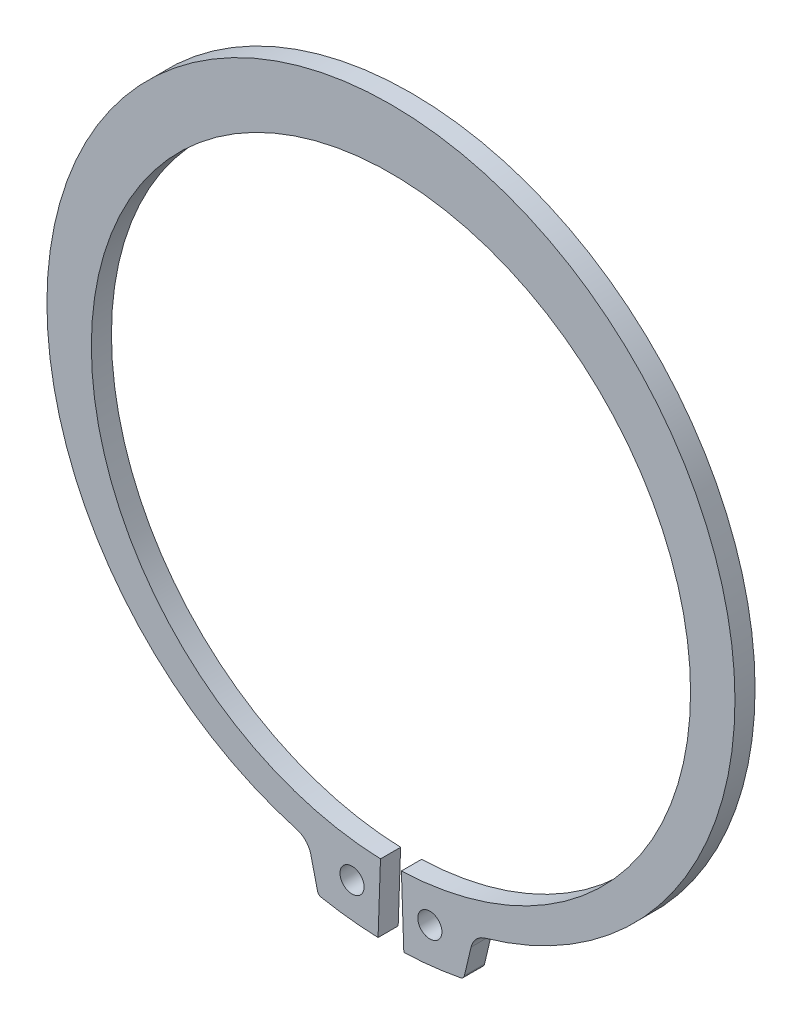
ISO-10303-21;
HEADER;
FILE_DESCRIPTION(('STEP AP214'),'2;1');
FILE_NAME('part.step','',(''),(''),'','','');
FILE_SCHEMA(('AUTOMOTIVE_DESIGN { 1 0 10303 214 1 1 1 1 }'));
ENDSEC;
DATA;
#1=APPLICATION_CONTEXT('core data for automotive mechanical design processes');
#2=APPLICATION_PROTOCOL_DEFINITION('international standard','automotive_design',2000,#1);
#3=PRODUCT_CONTEXT('',#1,'mechanical');
#4=PRODUCT('Part','Part','',(#3));
#5=PRODUCT_RELATED_PRODUCT_CATEGORY('part','',(#4));
#6=PRODUCT_DEFINITION_FORMATION('','',#4);
#7=PRODUCT_DEFINITION_CONTEXT('part definition',#1,'design');
#8=PRODUCT_DEFINITION('design','',#6,#7);
#9=PRODUCT_DEFINITION_SHAPE('','',#8);
#10=(LENGTH_UNIT() NAMED_UNIT(*) SI_UNIT(.MILLI.,.METRE.));
#11=(NAMED_UNIT(*) PLANE_ANGLE_UNIT() SI_UNIT($,.RADIAN.));
#12=(NAMED_UNIT(*) SI_UNIT($,.STERADIAN.) SOLID_ANGLE_UNIT());
#13=UNCERTAINTY_MEASURE_WITH_UNIT(LENGTH_MEASURE(1.E-05),#10,'distance_accuracy_value','');
#14=(GEOMETRIC_REPRESENTATION_CONTEXT(3) GLOBAL_UNCERTAINTY_ASSIGNED_CONTEXT((#13)) GLOBAL_UNIT_ASSIGNED_CONTEXT((#10,
#11,#12)) REPRESENTATION_CONTEXT('',''));
#15=CARTESIAN_POINT('',(0.,0.,0.));
#16=DIRECTION('',(0.,0.,1.));
#17=DIRECTION('',(1.,0.,0.));
#18=AXIS2_PLACEMENT_3D('',#15,#16,#17);
#19=CARTESIAN_POINT('',(0.,1.87892442697375,1.25));
#20=DIRECTION('',(0.,0.,1.));
#21=DIRECTION('',(1.,0.,0.));
#22=AXIS2_PLACEMENT_3D('',#19,#20,#21);
#23=PLANE('',#22);
#24=DIRECTION('',(0.229896172668286,-0.973215161098754,0.));
#25=VECTOR('',#24,1.);
#26=CARTESIAN_POINT('',(-9.04186023965457,-44.9781151222981,1.25));
#27=LINE('',#26,#25);
#28=CARTESIAN_POINT('',(-9.96002038573258,-41.0912849758516,1.25));
#29=VERTEX_POINT('',#28);
#30=CARTESIAN_POINT('',(-9.13467461806363,-44.585205752876,1.25));
#31=VERTEX_POINT('',#30);
#32=EDGE_CURVE('E195',#29,#31,#27,.T.);
#33=ORIENTED_EDGE('',*,*,#32,.T.);
#34=CARTESIAN_POINT('',(-8.52494547942181,-44.4411734762108,1.25));
#35=DIRECTION('',(0.,0.,1.));
#36=DIRECTION('',(1.,0.,0.));
#37=AXIS2_PLACEMENT_3D('',#34,#35,#36);
#38=CIRCLE('',#37,0.62651011103592);
#39=CARTESIAN_POINT('',(-8.64297409540711,-45.0564654110181,1.25));
#40=VERTEX_POINT('',#39);
#41=EDGE_CURVE('E12',#31,#40,#38,.T.);
#42=ORIENTED_EDGE('',*,*,#41,.T.);
#43=CARTESIAN_POINT('',(0.,0.,1.25));
#44=DIRECTION('',(0.,0.,1.));
#45=DIRECTION('',(1.,0.,0.));
#46=AXIS2_PLACEMENT_3D('',#43,#44,#45);
#47=CIRCLE('',#46,45.877947606101);
#48=CARTESIAN_POINT('',(-1.60111728119671,-45.85,1.25));
#49=VERTEX_POINT('',#48);
#50=EDGE_CURVE('E198',#40,#49,#47,.T.);
#51=ORIENTED_EDGE('',*,*,#50,.T.);
#52=DIRECTION('',(0.034899496702504,0.999390827019096,0.));
#53=VECTOR('',#52,1.);
#54=CARTESIAN_POINT('',(-1.60111728119671,-45.85,1.25));
#55=LINE('',#54,#53);
#56=CARTESIAN_POINT('',(-1.30000625216822,-37.2273083064613,1.25));
#57=VERTEX_POINT('',#56);
#58=EDGE_CURVE('E200',#49,#57,#55,.T.);
#59=ORIENTED_EDGE('',*,*,#58,.T.);
#60=CARTESIAN_POINT('',(0.,0.,1.25));
#61=DIRECTION('',(0.,0.,-1.));
#62=DIRECTION('',(1.,0.,0.));
#63=AXIS2_PLACEMENT_3D('',#60,#61,#62);
#64=CIRCLE('',#63,37.25);
#65=CARTESIAN_POINT('',(1.30000625216819,-37.2273083064613,1.25));
#66=VERTEX_POINT('',#65);
#67=EDGE_CURVE('E154',#57,#66,#64,.T.);
#68=ORIENTED_EDGE('',*,*,#67,.T.);
#69=DIRECTION('',(-0.0348994967025033,0.999390827019096,0.));
#70=VECTOR('',#69,1.);
#71=CARTESIAN_POINT('',(1.60111728119667,-45.85,1.25));
#72=LINE('',#71,#70);
#73=CARTESIAN_POINT('',(1.60111728119667,-45.85,1.25));
#74=VERTEX_POINT('',#73);
#75=EDGE_CURVE('E134',#74,#66,#72,.T.);
#76=ORIENTED_EDGE('',*,*,#75,.F.);
#77=CARTESIAN_POINT('',(0.,0.,1.25));
#78=DIRECTION('',(0.,0.,-1.));
#79=DIRECTION('',(-1.,0.,0.));
#80=AXIS2_PLACEMENT_3D('',#77,#78,#79);
#81=CIRCLE('',#80,45.877947606101);
#82=CARTESIAN_POINT('',(8.64297409540708,-45.0564654110181,1.25));
#83=VERTEX_POINT('',#82);
#84=EDGE_CURVE('E144',#83,#74,#81,.T.);
#85=ORIENTED_EDGE('',*,*,#84,.F.);
#86=CARTESIAN_POINT('',(8.52494547942178,-44.4411734762108,1.25));
#87=DIRECTION('',(0.,0.,-1.));
#88=DIRECTION('',(-1.,0.,0.));
#89=AXIS2_PLACEMENT_3D('',#86,#87,#88);
#90=CIRCLE('',#89,0.62651011103592);
#91=CARTESIAN_POINT('',(9.1346746180636,-44.585205752876,1.25));
#92=VERTEX_POINT('',#91);
#93=EDGE_CURVE('E183',#92,#83,#90,.T.);
#94=ORIENTED_EDGE('',*,*,#93,.F.);
#95=DIRECTION('',(-0.229896172668286,-0.973215161098754,0.));
#96=VECTOR('',#95,1.);
#97=CARTESIAN_POINT('',(9.04186023965454,-44.9781151222981,1.25));
#98=LINE('',#97,#96);
#99=CARTESIAN_POINT('',(9.96002038573255,-41.0912849758516,1.25));
#100=VERTEX_POINT('',#99);
#101=EDGE_CURVE('E150',#100,#92,#98,.T.);
#102=ORIENTED_EDGE('',*,*,#101,.F.);
#103=CARTESIAN_POINT('',(12.3989369402998,-41.6674140825122,1.25));
#104=DIRECTION('',(0.,0.,-1.));
#105=DIRECTION('',(-1.,0.,0.));
#106=AXIS2_PLACEMENT_3D('',#103,#104,#105);
#107=CIRCLE('',#106,2.50604044414368);
#108=CARTESIAN_POINT('',(11.7126689053615,-39.2571703413304,1.25));
#109=VERTEX_POINT('',#108);
#110=EDGE_CURVE('E174',#109,#100,#107,.F.);
#111=ORIENTED_EDGE('',*,*,#110,.F.);
#112=CARTESIAN_POINT('',(0.,1.87892442697375,1.25));
#113=DIRECTION('',(0.,0.,1.));
#114=DIRECTION('',(1.,0.,0.));
#115=AXIS2_PLACEMENT_3D('',#112,#113,#114);
#116=CIRCLE('',#115,42.7710755730263);
#117=CARTESIAN_POINT('',(-11.7126689053615,-39.2571703413304,1.25));
#118=VERTEX_POINT('',#117);
#119=EDGE_CURVE('E192',#109,#118,#116,.T.);
#120=ORIENTED_EDGE('',*,*,#119,.T.);
#121=CARTESIAN_POINT('',(-12.3989369402999,-41.6674140825122,1.25));
#122=DIRECTION('',(0.,0.,1.));
#123=DIRECTION('',(1.,0.,0.));
#124=AXIS2_PLACEMENT_3D('',#121,#122,#123);
#125=CIRCLE('',#124,2.50604044414368);
#126=EDGE_CURVE('E225',#118,#29,#125,.F.);
#127=ORIENTED_EDGE('',*,*,#126,.T.);
#128=EDGE_LOOP('',(#33,#42,#51,#59,#68,#76,#85,#94,#102,#111,#120,#127));
#129=FACE_BOUND('',#128,.T.);
#130=CARTESIAN_POINT('',(-4.83725133822565,-41.2815324060469,1.25));
#131=DIRECTION('',(0.,0.,1.));
#132=DIRECTION('',(1.,0.,0.));
#133=AXIS2_PLACEMENT_3D('',#130,#131,#132);
#134=CIRCLE('',#133,1.5);
#135=CARTESIAN_POINT('',(-3.33725133822565,-41.2815324060469,1.25));
#136=VERTEX_POINT('',#135);
#137=EDGE_CURVE('E186',#136,#136,#134,.T.);
#138=ORIENTED_EDGE('',*,*,#137,.F.);
#139=EDGE_LOOP('',(#138));
#140=FACE_BOUND('',#139,.T.);
#141=CARTESIAN_POINT('',(4.83725133822562,-41.2815324060469,1.25));
#142=DIRECTION('',(0.,0.,-1.));
#143=DIRECTION('',(-1.,0.,0.));
#144=AXIS2_PLACEMENT_3D('',#141,#142,#143);
#145=CIRCLE('',#144,1.5);
#146=CARTESIAN_POINT('',(3.33725133822562,-41.2815324060469,1.25));
#147=VERTEX_POINT('',#146);
#148=EDGE_CURVE('E164',#147,#147,#145,.T.);
#149=ORIENTED_EDGE('',*,*,#148,.T.);
#150=EDGE_LOOP('',(#149));
#151=FACE_BOUND('',#150,.T.);
#152=ADVANCED_FACE('F40',(#129,#140,#151),#23,.T.);
#153=CARTESIAN_POINT('',(0.,1.87892442697375,-1.25));
#154=DIRECTION('',(0.,0.,1.));
#155=DIRECTION('',(1.,0.,0.));
#156=AXIS2_PLACEMENT_3D('',#153,#154,#155);
#157=PLANE('',#156);
#158=CARTESIAN_POINT('',(0.,0.,-1.25));
#159=DIRECTION('',(0.,0.,1.));
#160=DIRECTION('',(1.,0.,0.));
#161=AXIS2_PLACEMENT_3D('',#158,#159,#160);
#162=CIRCLE('',#161,45.877947606101);
#163=CARTESIAN_POINT('',(-8.64297409540711,-45.0564654110181,-1.25));
#164=VERTEX_POINT('',#163);
#165=CARTESIAN_POINT('',(-1.60111728119671,-45.85,-1.25));
#166=VERTEX_POINT('',#165);
#167=EDGE_CURVE('E208',#164,#166,#162,.T.);
#168=ORIENTED_EDGE('',*,*,#167,.F.);
#169=CARTESIAN_POINT('',(-8.52494547942181,-44.4411734762108,-1.25));
#170=DIRECTION('',(0.,0.,1.));
#171=DIRECTION('',(1.,0.,0.));
#172=AXIS2_PLACEMENT_3D('',#169,#170,#171);
#173=CIRCLE('',#172,0.62651011103592);
#174=CARTESIAN_POINT('',(-9.13467461806363,-44.585205752876,-1.25));
#175=VERTEX_POINT('',#174);
#176=EDGE_CURVE('E62',#164,#175,#173,.F.);
#177=ORIENTED_EDGE('',*,*,#176,.T.);
#178=DIRECTION('',(0.229896172668286,-0.973215161098754,0.));
#179=VECTOR('',#178,1.);
#180=CARTESIAN_POINT('',(-9.04186023965457,-44.9781151222981,-1.25));
#181=LINE('',#180,#179);
#182=CARTESIAN_POINT('',(-9.96002038573258,-41.0912849758516,-1.25));
#183=VERTEX_POINT('',#182);
#184=EDGE_CURVE('E206',#183,#175,#181,.T.);
#185=ORIENTED_EDGE('',*,*,#184,.F.);
#186=CARTESIAN_POINT('',(-12.3989369402999,-41.6674140825122,-1.25));
#187=DIRECTION('',(0.,0.,1.));
#188=DIRECTION('',(1.,0.,0.));
#189=AXIS2_PLACEMENT_3D('',#186,#187,#188);
#190=CIRCLE('',#189,2.50604044414368);
#191=CARTESIAN_POINT('',(-11.7126689053615,-39.2571703413304,-1.25));
#192=VERTEX_POINT('',#191);
#193=EDGE_CURVE('E223',#183,#192,#190,.T.);
#194=ORIENTED_EDGE('',*,*,#193,.T.);
#195=CARTESIAN_POINT('',(0.,1.87892442697375,-1.25));
#196=DIRECTION('',(0.,0.,1.));
#197=DIRECTION('',(1.,0.,0.));
#198=AXIS2_PLACEMENT_3D('',#195,#196,#197);
#199=CIRCLE('',#198,42.7710755730263);
#200=CARTESIAN_POINT('',(11.7126689053615,-39.2571703413304,-1.25));
#201=VERTEX_POINT('',#200);
#202=EDGE_CURVE('E189',#201,#192,#199,.T.);
#203=ORIENTED_EDGE('',*,*,#202,.F.);
#204=CARTESIAN_POINT('',(12.3989369402998,-41.6674140825122,-1.25));
#205=DIRECTION('',(0.,0.,-1.));
#206=DIRECTION('',(-1.,0.,0.));
#207=AXIS2_PLACEMENT_3D('',#204,#205,#206);
#208=CIRCLE('',#207,2.50604044414368);
#209=CARTESIAN_POINT('',(9.96002038573255,-41.0912849758516,-1.25));
#210=VERTEX_POINT('',#209);
#211=EDGE_CURVE('E171',#210,#201,#208,.T.);
#212=ORIENTED_EDGE('',*,*,#211,.F.);
#213=DIRECTION('',(-0.229896172668286,-0.973215161098754,0.));
#214=VECTOR('',#213,1.);
#215=CARTESIAN_POINT('',(9.04186023965454,-44.9781151222981,-1.25));
#216=LINE('',#215,#214);
#217=CARTESIAN_POINT('',(9.1346746180636,-44.585205752876,-1.25));
#218=VERTEX_POINT('',#217);
#219=EDGE_CURVE('E160',#210,#218,#216,.T.);
#220=ORIENTED_EDGE('',*,*,#219,.T.);
#221=CARTESIAN_POINT('',(8.52494547942178,-44.4411734762108,-1.25));
#222=DIRECTION('',(0.,0.,-1.));
#223=DIRECTION('',(-1.,0.,0.));
#224=AXIS2_PLACEMENT_3D('',#221,#222,#223);
#225=CIRCLE('',#224,0.62651011103592);
#226=CARTESIAN_POINT('',(8.64297409540708,-45.0564654110181,-1.25));
#227=VERTEX_POINT('',#226);
#228=EDGE_CURVE('E178',#227,#218,#225,.F.);
#229=ORIENTED_EDGE('',*,*,#228,.F.);
#230=CARTESIAN_POINT('',(0.,0.,-1.25));
#231=DIRECTION('',(0.,0.,-1.));
#232=DIRECTION('',(-1.,0.,0.));
#233=AXIS2_PLACEMENT_3D('',#230,#231,#232);
#234=CIRCLE('',#233,45.877947606101);
#235=CARTESIAN_POINT('',(1.60111728119667,-45.85,-1.25));
#236=VERTEX_POINT('',#235);
#237=EDGE_CURVE('E163',#227,#236,#234,.T.);
#238=ORIENTED_EDGE('',*,*,#237,.T.);
#239=DIRECTION('',(-0.0348994967025033,0.999390827019096,0.));
#240=VECTOR('',#239,1.);
#241=CARTESIAN_POINT('',(1.60111728119667,-45.85,-1.25));
#242=LINE('',#241,#240);
#243=CARTESIAN_POINT('',(1.30000625216819,-37.2273083064613,-1.25));
#244=VERTEX_POINT('',#243);
#245=EDGE_CURVE('E136',#236,#244,#242,.T.);
#246=ORIENTED_EDGE('',*,*,#245,.T.);
#247=CARTESIAN_POINT('',(0.,0.,-1.25));
#248=DIRECTION('',(0.,0.,-1.));
#249=DIRECTION('',(1.,0.,0.));
#250=AXIS2_PLACEMENT_3D('',#247,#248,#249);
#251=CIRCLE('',#250,37.25);
#252=CARTESIAN_POINT('',(-1.30000625216822,-37.2273083064613,-1.25));
#253=VERTEX_POINT('',#252);
#254=EDGE_CURVE('E196',#253,#244,#251,.T.);
#255=ORIENTED_EDGE('',*,*,#254,.F.);
#256=DIRECTION('',(0.034899496702504,0.999390827019096,0.));
#257=VECTOR('',#256,1.);
#258=CARTESIAN_POINT('',(-1.60111728119671,-45.85,-1.25));
#259=LINE('',#258,#257);
#260=EDGE_CURVE('E210',#166,#253,#259,.T.);
#261=ORIENTED_EDGE('',*,*,#260,.F.);
#262=EDGE_LOOP('',(#168,#177,#185,#194,#203,#212,#220,#229,#238,#246,#255,#261));
#263=FACE_BOUND('',#262,.T.);
#264=CARTESIAN_POINT('',(-4.83725133822565,-41.2815324060469,-1.25));
#265=DIRECTION('',(0.,0.,1.));
#266=DIRECTION('',(1.,0.,0.));
#267=AXIS2_PLACEMENT_3D('',#264,#265,#266);
#268=CIRCLE('',#267,1.5);
#269=CARTESIAN_POINT('',(-3.33725133822565,-41.2815324060469,-1.25));
#270=VERTEX_POINT('',#269);
#271=EDGE_CURVE('E185',#270,#270,#268,.T.);
#272=ORIENTED_EDGE('',*,*,#271,.T.);
#273=EDGE_LOOP('',(#272));
#274=FACE_BOUND('',#273,.T.);
#275=CARTESIAN_POINT('',(4.83725133822562,-41.2815324060469,-1.25));
#276=DIRECTION('',(0.,0.,-1.));
#277=DIRECTION('',(-1.,0.,0.));
#278=AXIS2_PLACEMENT_3D('',#275,#276,#277);
#279=CIRCLE('',#278,1.5);
#280=CARTESIAN_POINT('',(3.33725133822562,-41.2815324060469,-1.25));
#281=VERTEX_POINT('',#280);
#282=EDGE_CURVE('E258',#281,#281,#279,.T.);
#283=ORIENTED_EDGE('',*,*,#282,.F.);
#284=EDGE_LOOP('',(#283));
#285=FACE_BOUND('',#284,.T.);
#286=ADVANCED_FACE('F238',(#263,#274,#285),#157,.F.);
#287=CARTESIAN_POINT('',(0.,1.87892442697375,1.25));
#288=DIRECTION('',(0.,0.,-1.));
#289=DIRECTION('',(-1.,0.,0.));
#290=AXIS2_PLACEMENT_3D('',#287,#288,#289);
#291=CYLINDRICAL_SURFACE('',#290,42.7710755730263);
#292=ORIENTED_EDGE('',*,*,#202,.T.);
#293=DIRECTION('',(0.,0.,-1.));
#294=VECTOR('',#293,1.);
#295=CARTESIAN_POINT('',(-11.7126689053615,-39.2571703413304,1.25));
#296=LINE('',#295,#294);
#297=EDGE_CURVE('E221',#192,#118,#296,.F.);
#298=ORIENTED_EDGE('',*,*,#297,.T.);
#299=ORIENTED_EDGE('',*,*,#119,.F.);
#300=DIRECTION('',(0.,0.,-1.));
#301=VECTOR('',#300,1.);
#302=CARTESIAN_POINT('',(11.7126689053615,-39.2571703413304,1.25));
#303=LINE('',#302,#301);
#304=EDGE_CURVE('E168',#201,#109,#303,.F.);
#305=ORIENTED_EDGE('',*,*,#304,.F.);
#306=EDGE_LOOP('',(#292,#298,#299,#305));
#307=FACE_BOUND('',#306,.T.);
#308=ADVANCED_FACE('F273',(#307),#291,.T.);
#309=CARTESIAN_POINT('',(-9.04186023965457,-44.9781151222981,1.25));
#310=DIRECTION('',(0.973215161098754,0.229896172668286,0.));
#311=DIRECTION('',(-0.229896172668286,0.973215161098754,0.));
#312=AXIS2_PLACEMENT_3D('',#309,#310,#311);
#313=PLANE('',#312);
#314=ORIENTED_EDGE('',*,*,#184,.T.);
#315=DIRECTION('',(0.,0.,-1.));
#316=VECTOR('',#315,1.);
#317=CARTESIAN_POINT('',(-9.13467461806363,-44.585205752876,1.25));
#318=LINE('',#317,#316);
#319=EDGE_CURVE('E48',#175,#31,#318,.F.);
#320=ORIENTED_EDGE('',*,*,#319,.T.);
#321=ORIENTED_EDGE('',*,*,#32,.F.);
#322=DIRECTION('',(0.,0.,1.));
#323=VECTOR('',#322,1.);
#324=CARTESIAN_POINT('',(-9.96002038573258,-41.0912849758516,-1.25));
#325=LINE('',#324,#323);
#326=EDGE_CURVE('E218',#29,#183,#325,.F.);
#327=ORIENTED_EDGE('',*,*,#326,.T.);
#328=EDGE_LOOP('',(#314,#320,#321,#327));
#329=FACE_BOUND('',#328,.T.);
#330=ADVANCED_FACE('F279',(#329),#313,.F.);
#331=CARTESIAN_POINT('',(0.,0.,1.25));
#332=DIRECTION('',(0.,0.,-1.));
#333=DIRECTION('',(-1.,0.,0.));
#334=AXIS2_PLACEMENT_3D('',#331,#332,#333);
#335=CYLINDRICAL_SURFACE('',#334,45.877947606101);
#336=ORIENTED_EDGE('',*,*,#50,.F.);
#337=DIRECTION('',(0.,0.,-1.));
#338=VECTOR('',#337,1.);
#339=CARTESIAN_POINT('',(-8.64297409540711,-45.0564654110181,1.25));
#340=LINE('',#339,#338);
#341=EDGE_CURVE('E227',#40,#164,#340,.T.);
#342=ORIENTED_EDGE('',*,*,#341,.T.);
#343=ORIENTED_EDGE('',*,*,#167,.T.);
#344=DIRECTION('',(0.,0.,-1.));
#345=VECTOR('',#344,1.);
#346=CARTESIAN_POINT('',(-1.60111728119671,-45.85,1.25));
#347=LINE('',#346,#345);
#348=EDGE_CURVE('E215',#49,#166,#347,.T.);
#349=ORIENTED_EDGE('',*,*,#348,.F.);
#350=EDGE_LOOP('',(#336,#342,#343,#349));
#351=FACE_BOUND('',#350,.T.);
#352=ADVANCED_FACE('F233',(#351),#335,.T.);
#353=CARTESIAN_POINT('',(-1.60111728119671,-45.85,1.25));
#354=DIRECTION('',(-0.999390827019096,0.034899496702504,0.));
#355=DIRECTION('',(-0.034899496702504,-0.999390827019096,0.));
#356=AXIS2_PLACEMENT_3D('',#353,#354,#355);
#357=PLANE('',#356);
#358=ORIENTED_EDGE('',*,*,#260,.T.);
#359=DIRECTION('',(0.,0.,-1.));
#360=VECTOR('',#359,1.);
#361=CARTESIAN_POINT('',(-1.30000625216822,-37.2273083064613,1.25));
#362=LINE('',#361,#360);
#363=EDGE_CURVE('E203',#57,#253,#362,.T.);
#364=ORIENTED_EDGE('',*,*,#363,.F.);
#365=ORIENTED_EDGE('',*,*,#58,.F.);
#366=ORIENTED_EDGE('',*,*,#348,.T.);
#367=EDGE_LOOP('',(#358,#364,#365,#366));
#368=FACE_BOUND('',#367,.T.);
#369=ADVANCED_FACE('F243',(#368),#357,.F.);
#370=CARTESIAN_POINT('',(0.,0.,1.25));
#371=DIRECTION('',(0.,0.,-1.));
#372=DIRECTION('',(-1.,0.,0.));
#373=AXIS2_PLACEMENT_3D('',#370,#371,#372);
#374=CYLINDRICAL_SURFACE('',#373,37.25);
#375=ORIENTED_EDGE('',*,*,#254,.T.);
#376=DIRECTION('',(0.,0.,-1.));
#377=VECTOR('',#376,1.);
#378=CARTESIAN_POINT('',(1.30000625216819,-37.2273083064613,1.25));
#379=LINE('',#378,#377);
#380=EDGE_CURVE('E141',#66,#244,#379,.T.);
#381=ORIENTED_EDGE('',*,*,#380,.F.);
#382=ORIENTED_EDGE('',*,*,#67,.F.);
#383=ORIENTED_EDGE('',*,*,#363,.T.);
#384=EDGE_LOOP('',(#375,#381,#382,#383));
#385=FACE_BOUND('',#384,.T.);
#386=ADVANCED_FACE('F246',(#385),#374,.F.);
#387=CARTESIAN_POINT('',(-4.83725133822565,-41.2815324060469,1.25));
#388=DIRECTION('',(0.,0.,-1.));
#389=DIRECTION('',(-1.,0.,0.));
#390=AXIS2_PLACEMENT_3D('',#387,#388,#389);
#391=CYLINDRICAL_SURFACE('',#390,1.5);
#392=ORIENTED_EDGE('',*,*,#137,.T.);
#393=EDGE_LOOP('',(#392));
#394=FACE_BOUND('',#393,.T.);
#395=ORIENTED_EDGE('',*,*,#271,.F.);
#396=EDGE_LOOP('',(#395));
#397=FACE_BOUND('',#396,.T.);
#398=ADVANCED_FACE('F287',(#394,#397),#391,.F.);
#399=CARTESIAN_POINT('',(-12.3989369402999,-41.6674140825122,1.25));
#400=DIRECTION('',(0.,0.,-1.));
#401=DIRECTION('',(-1.,0.,0.));
#402=AXIS2_PLACEMENT_3D('',#399,#400,#401);
#403=CYLINDRICAL_SURFACE('',#402,2.50604044414368);
#404=ORIENTED_EDGE('',*,*,#126,.F.);
#405=ORIENTED_EDGE('',*,*,#297,.F.);
#406=ORIENTED_EDGE('',*,*,#193,.F.);
#407=ORIENTED_EDGE('',*,*,#326,.F.);
#408=EDGE_LOOP('',(#404,#405,#406,#407));
#409=FACE_BOUND('',#408,.T.);
#410=ADVANCED_FACE('F293',(#409),#403,.F.);
#411=CARTESIAN_POINT('',(-8.52494547942181,-44.4411734762108,1.25));
#412=DIRECTION('',(0.,0.,-1.));
#413=DIRECTION('',(-1.,0.,0.));
#414=AXIS2_PLACEMENT_3D('',#411,#412,#413);
#415=CYLINDRICAL_SURFACE('',#414,0.62651011103592);
#416=ORIENTED_EDGE('',*,*,#41,.F.);
#417=ORIENTED_EDGE('',*,*,#319,.F.);
#418=ORIENTED_EDGE('',*,*,#176,.F.);
#419=ORIENTED_EDGE('',*,*,#341,.F.);
#420=EDGE_LOOP('',(#416,#417,#418,#419));
#421=FACE_BOUND('',#420,.T.);
#422=ADVANCED_FACE('F42',(#421),#415,.T.);
#423=CARTESIAN_POINT('',(9.04186023965454,-44.9781151222981,1.25));
#424=DIRECTION('',(-0.973215161098754,0.229896172668286,0.));
#425=DIRECTION('',(0.229896172668286,0.973215161098754,0.));
#426=AXIS2_PLACEMENT_3D('',#423,#424,#425);
#427=PLANE('',#426);
#428=ORIENTED_EDGE('',*,*,#219,.F.);
#429=DIRECTION('',(0.,0.,1.));
#430=VECTOR('',#429,1.);
#431=CARTESIAN_POINT('',(9.96002038573255,-41.0912849758516,-1.25));
#432=LINE('',#431,#430);
#433=EDGE_CURVE('E140',#100,#210,#432,.F.);
#434=ORIENTED_EDGE('',*,*,#433,.F.);
#435=ORIENTED_EDGE('',*,*,#101,.T.);
#436=DIRECTION('',(0.,0.,-1.));
#437=VECTOR('',#436,1.);
#438=CARTESIAN_POINT('',(9.1346746180636,-44.585205752876,1.25));
#439=LINE('',#438,#437);
#440=EDGE_CURVE('E181',#218,#92,#439,.F.);
#441=ORIENTED_EDGE('',*,*,#440,.F.);
#442=EDGE_LOOP('',(#428,#434,#435,#441));
#443=FACE_BOUND('',#442,.T.);
#444=ADVANCED_FACE('F256',(#443),#427,.F.);
#445=CARTESIAN_POINT('',(0.,0.,1.25));
#446=DIRECTION('',(0.,0.,-1.));
#447=DIRECTION('',(1.,0.,0.));
#448=AXIS2_PLACEMENT_3D('',#445,#446,#447);
#449=CYLINDRICAL_SURFACE('',#448,45.877947606101);
#450=ORIENTED_EDGE('',*,*,#84,.T.);
#451=DIRECTION('',(0.,0.,-1.));
#452=VECTOR('',#451,1.);
#453=CARTESIAN_POINT('',(1.60111728119667,-45.85,1.25));
#454=LINE('',#453,#452);
#455=EDGE_CURVE('E129',#74,#236,#454,.T.);
#456=ORIENTED_EDGE('',*,*,#455,.T.);
#457=ORIENTED_EDGE('',*,*,#237,.F.);
#458=DIRECTION('',(0.,0.,-1.));
#459=VECTOR('',#458,1.);
#460=CARTESIAN_POINT('',(8.64297409540708,-45.0564654110181,1.25));
#461=LINE('',#460,#459);
#462=EDGE_CURVE('E146',#83,#227,#461,.T.);
#463=ORIENTED_EDGE('',*,*,#462,.F.);
#464=EDGE_LOOP('',(#450,#456,#457,#463));
#465=FACE_BOUND('',#464,.T.);
#466=ADVANCED_FACE('F145',(#465),#449,.T.);
#467=CARTESIAN_POINT('',(1.60111728119667,-45.85,1.25));
#468=DIRECTION('',(0.999390827019096,0.0348994967025033,0.));
#469=DIRECTION('',(0.0348994967025033,-0.999390827019096,0.));
#470=AXIS2_PLACEMENT_3D('',#467,#468,#469);
#471=PLANE('',#470);
#472=ORIENTED_EDGE('',*,*,#245,.F.);
#473=ORIENTED_EDGE('',*,*,#455,.F.);
#474=ORIENTED_EDGE('',*,*,#75,.T.);
#475=ORIENTED_EDGE('',*,*,#380,.T.);
#476=EDGE_LOOP('',(#472,#473,#474,#475));
#477=FACE_BOUND('',#476,.T.);
#478=ADVANCED_FACE('F131',(#477),#471,.F.);
#479=CARTESIAN_POINT('',(4.83725133822562,-41.2815324060469,1.25));
#480=DIRECTION('',(0.,0.,-1.));
#481=DIRECTION('',(1.,0.,0.));
#482=AXIS2_PLACEMENT_3D('',#479,#480,#481);
#483=CYLINDRICAL_SURFACE('',#482,1.5);
#484=ORIENTED_EDGE('',*,*,#148,.F.);
#485=EDGE_LOOP('',(#484));
#486=FACE_BOUND('',#485,.T.);
#487=ORIENTED_EDGE('',*,*,#282,.T.);
#488=EDGE_LOOP('',(#487));
#489=FACE_BOUND('',#488,.T.);
#490=ADVANCED_FACE('F265',(#486,#489),#483,.F.);
#491=CARTESIAN_POINT('',(12.3989369402998,-41.6674140825122,1.25));
#492=DIRECTION('',(0.,0.,-1.));
#493=DIRECTION('',(1.,0.,0.));
#494=AXIS2_PLACEMENT_3D('',#491,#492,#493);
#495=CYLINDRICAL_SURFACE('',#494,2.50604044414368);
#496=ORIENTED_EDGE('',*,*,#110,.T.);
#497=ORIENTED_EDGE('',*,*,#433,.T.);
#498=ORIENTED_EDGE('',*,*,#211,.T.);
#499=ORIENTED_EDGE('',*,*,#304,.T.);
#500=EDGE_LOOP('',(#496,#497,#498,#499));
#501=FACE_BOUND('',#500,.T.);
#502=ADVANCED_FACE('F268',(#501),#495,.F.);
#503=CARTESIAN_POINT('',(8.52494547942178,-44.4411734762108,1.25));
#504=DIRECTION('',(0.,0.,-1.));
#505=DIRECTION('',(1.,0.,0.));
#506=AXIS2_PLACEMENT_3D('',#503,#504,#505);
#507=CYLINDRICAL_SURFACE('',#506,0.62651011103592);
#508=ORIENTED_EDGE('',*,*,#93,.T.);
#509=ORIENTED_EDGE('',*,*,#462,.T.);
#510=ORIENTED_EDGE('',*,*,#228,.T.);
#511=ORIENTED_EDGE('',*,*,#440,.T.);
#512=EDGE_LOOP('',(#508,#509,#510,#511));
#513=FACE_BOUND('',#512,.T.);
#514=ADVANCED_FACE('F251',(#513),#507,.T.);
#515=CLOSED_SHELL('',(#152,#286,#308,#330,#352,#369,#386,#398,#410,#422,#444,#466,#478,#490,
#502,#514));
#516=MANIFOLD_SOLID_BREP('B2',#515);
#517=ADVANCED_BREP_SHAPE_REPRESENTATION('',(#18,#516),#14);
#518=SHAPE_DEFINITION_REPRESENTATION(#9,#517);
ENDSEC;
END-ISO-10303-21;
